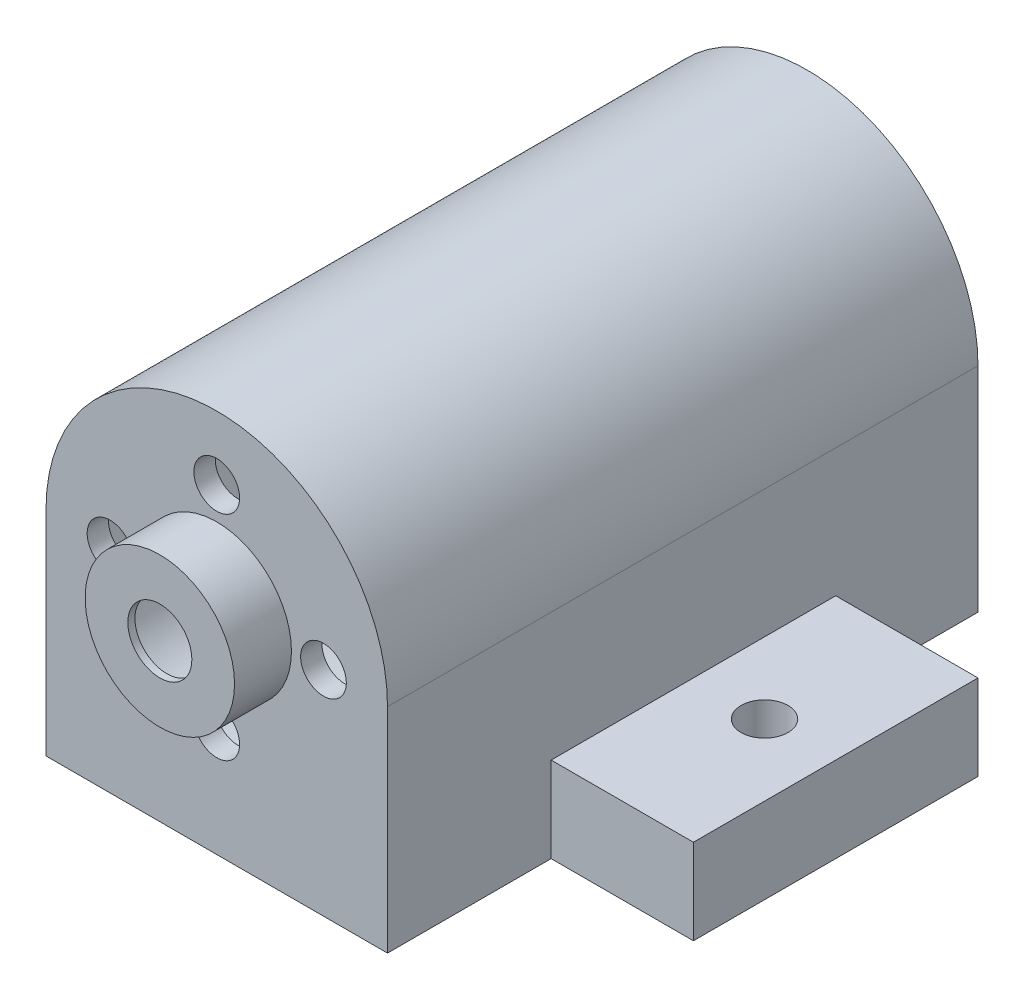
ISO-10303-21;
HEADER;
FILE_DESCRIPTION(('STEP AP214'),'2;1');
FILE_NAME('part.step','',(''),(''),'','','');
FILE_SCHEMA(('AUTOMOTIVE_DESIGN { 1 0 10303 214 1 1 1 1 }'));
ENDSEC;
DATA;
#1=APPLICATION_CONTEXT('core data for automotive mechanical design processes');
#2=APPLICATION_PROTOCOL_DEFINITION('international standard','automotive_design',2000,#1);
#3=PRODUCT_CONTEXT('',#1,'mechanical');
#4=PRODUCT('Part','Part','',(#3));
#5=PRODUCT_RELATED_PRODUCT_CATEGORY('part','',(#4));
#6=PRODUCT_DEFINITION_FORMATION('','',#4);
#7=PRODUCT_DEFINITION_CONTEXT('part definition',#1,'design');
#8=PRODUCT_DEFINITION('design','',#6,#7);
#9=PRODUCT_DEFINITION_SHAPE('','',#8);
#10=(LENGTH_UNIT() NAMED_UNIT(*) SI_UNIT(.MILLI.,.METRE.));
#11=(NAMED_UNIT(*) PLANE_ANGLE_UNIT() SI_UNIT($,.RADIAN.));
#12=(NAMED_UNIT(*) SI_UNIT($,.STERADIAN.) SOLID_ANGLE_UNIT());
#13=UNCERTAINTY_MEASURE_WITH_UNIT(LENGTH_MEASURE(1.E-05),#10,'distance_accuracy_value','');
#14=(GEOMETRIC_REPRESENTATION_CONTEXT(3) GLOBAL_UNCERTAINTY_ASSIGNED_CONTEXT((#13)) GLOBAL_UNIT_ASSIGNED_CONTEXT((#10,
#11,#12)) REPRESENTATION_CONTEXT('',''));
#15=CARTESIAN_POINT('',(0.,0.,0.));
#16=DIRECTION('',(0.,0.,1.));
#17=DIRECTION('',(1.,0.,0.));
#18=AXIS2_PLACEMENT_3D('',#15,#16,#17);
#19=CARTESIAN_POINT('',(-728.422782565498,1.40916900988348,1.5));
#20=DIRECTION('',(0.,0.,-1.));
#21=DIRECTION('',(-1.,0.,0.));
#22=AXIS2_PLACEMENT_3D('',#19,#20,#21);
#23=CYLINDRICAL_SURFACE('',#22,12.);
#24=DIRECTION('',(0.,0.,-1.));
#25=VECTOR('',#24,1.);
#26=CARTESIAN_POINT('',(-740.422782565498,1.40916900988348,1.5));
#27=LINE('',#26,#25);
#28=CARTESIAN_POINT('',(-740.422782565498,1.40916900988348,1.5));
#29=VERTEX_POINT('',#28);
#30=CARTESIAN_POINT('',(-740.422782565498,1.40916900988348,-40.));
#31=VERTEX_POINT('',#30);
#32=EDGE_CURVE('E248',#29,#31,#27,.T.);
#33=ORIENTED_EDGE('',*,*,#32,.F.);
#34=CARTESIAN_POINT('',(-728.422782565498,1.40916900988348,1.5));
#35=DIRECTION('',(0.,0.,1.));
#36=DIRECTION('',(1.,0.,0.));
#37=AXIS2_PLACEMENT_3D('',#34,#35,#36);
#38=CIRCLE('',#37,12.);
#39=CARTESIAN_POINT('',(-716.422782565498,1.40916900988348,1.5));
#40=VERTEX_POINT('',#39);
#41=EDGE_CURVE('E11',#40,#29,#38,.T.);
#42=ORIENTED_EDGE('',*,*,#41,.F.);
#43=DIRECTION('',(0.,0.,-1.));
#44=VECTOR('',#43,1.);
#45=CARTESIAN_POINT('',(-716.422782565498,1.40916900988348,1.5));
#46=LINE('',#45,#44);
#47=CARTESIAN_POINT('',(-716.422782565498,1.40916900988348,-40.));
#48=VERTEX_POINT('',#47);
#49=EDGE_CURVE('E238',#40,#48,#46,.T.);
#50=ORIENTED_EDGE('',*,*,#49,.T.);
#51=CARTESIAN_POINT('',(-728.422782565498,1.40916900988348,-40.));
#52=DIRECTION('',(0.,0.,-1.));
#53=DIRECTION('',(-1.,0.,0.));
#54=AXIS2_PLACEMENT_3D('',#51,#52,#53);
#55=CIRCLE('',#54,12.);
#56=EDGE_CURVE('E268',#31,#48,#55,.T.);
#57=ORIENTED_EDGE('',*,*,#56,.F.);
#58=EDGE_LOOP('',(#33,#42,#50,#57));
#59=FACE_BOUND('',#58,.T.);
#60=ADVANCED_FACE('F44',(#59),#23,.T.);
#61=CARTESIAN_POINT('',(-728.422782565498,1.40916900988348,0.));
#62=DIRECTION('',(0.,0.,1.));
#63=DIRECTION('',(1.,0.,0.));
#64=AXIS2_PLACEMENT_3D('',#61,#62,#63);
#65=PLANE('',#64);
#66=CARTESIAN_POINT('',(-735.922782565498,1.40916900988364,0.));
#67=DIRECTION('',(0.,0.,1.));
#68=DIRECTION('',(1.,0.,0.));
#69=AXIS2_PLACEMENT_3D('',#66,#67,#68);
#70=CIRCLE('',#69,1.60659030912174);
#71=CARTESIAN_POINT('',(-734.316192256376,1.40916900988364,0.));
#72=VERTEX_POINT('',#71);
#73=EDGE_CURVE('E300',#72,#72,#70,.T.);
#74=ORIENTED_EDGE('',*,*,#73,.T.);
#75=EDGE_LOOP('',(#74));
#76=FACE_BOUND('',#75,.T.);
#77=CARTESIAN_POINT('',(-728.422782565498,-6.09083099011652,0.));
#78=DIRECTION('',(0.,0.,1.));
#79=DIRECTION('',(1.,0.,0.));
#80=AXIS2_PLACEMENT_3D('',#77,#78,#79);
#81=CIRCLE('',#80,1.60659030912175);
#82=CARTESIAN_POINT('',(-726.816192256376,-6.09083099011652,0.));
#83=VERTEX_POINT('',#82);
#84=EDGE_CURVE('E315',#83,#83,#81,.T.);
#85=ORIENTED_EDGE('',*,*,#84,.T.);
#86=EDGE_LOOP('',(#85));
#87=FACE_BOUND('',#86,.T.);
#88=CARTESIAN_POINT('',(-720.922782565498,1.40916900988353,0.));
#89=DIRECTION('',(0.,0.,1.));
#90=DIRECTION('',(1.,0.,0.));
#91=AXIS2_PLACEMENT_3D('',#88,#89,#90);
#92=CIRCLE('',#91,1.60659030912174);
#93=CARTESIAN_POINT('',(-719.316192256376,1.40916900988353,0.));
#94=VERTEX_POINT('',#93);
#95=EDGE_CURVE('E319',#94,#94,#92,.T.);
#96=ORIENTED_EDGE('',*,*,#95,.T.);
#97=EDGE_LOOP('',(#96));
#98=FACE_BOUND('',#97,.T.);
#99=CARTESIAN_POINT('',(-728.422782565498,8.90916900988348,0.));
#100=DIRECTION('',(0.,0.,1.));
#101=DIRECTION('',(1.,0.,0.));
#102=AXIS2_PLACEMENT_3D('',#99,#100,#101);
#103=CIRCLE('',#102,1.60659030912175);
#104=CARTESIAN_POINT('',(-726.816192256376,8.90916900988348,0.));
#105=VERTEX_POINT('',#104);
#106=EDGE_CURVE('E53',#105,#105,#103,.T.);
#107=ORIENTED_EDGE('',*,*,#106,.T.);
#108=EDGE_LOOP('',(#107));
#109=FACE_BOUND('',#108,.T.);
#110=CARTESIAN_POINT('',(-728.422782565498,1.40916900988348,0.));
#111=DIRECTION('',(0.,0.,-1.));
#112=DIRECTION('',(-1.,0.,0.));
#113=AXIS2_PLACEMENT_3D('',#110,#111,#112);
#114=CIRCLE('',#113,5.09999999999998);
#115=CARTESIAN_POINT('',(-733.522782565498,1.40916900988348,0.));
#116=VERTEX_POINT('',#115);
#117=EDGE_CURVE('E284',#116,#116,#114,.T.);
#118=ORIENTED_EDGE('',*,*,#117,.F.);
#119=EDGE_LOOP('',(#118));
#120=FACE_BOUND('',#119,.T.);
#121=CARTESIAN_POINT('',(-728.422782565498,1.40916900988348,0.));
#122=DIRECTION('',(0.,0.,-1.));
#123=DIRECTION('',(-1.,0.,0.));
#124=AXIS2_PLACEMENT_3D('',#121,#122,#123);
#125=CIRCLE('',#124,11.2499999999999);
#126=CARTESIAN_POINT('',(-739.672782565498,1.40916900988348,0.));
#127=VERTEX_POINT('',#126);
#128=EDGE_CURVE('E252',#127,#127,#125,.T.);
#129=ORIENTED_EDGE('',*,*,#128,.T.);
#130=EDGE_LOOP('',(#129));
#131=FACE_BOUND('',#130,.T.);
#132=ADVANCED_FACE('F326',(#76,#87,#98,#109,#120,#131),#65,.F.);
#133=CARTESIAN_POINT('',(-728.422782565498,1.40916900988348,1.5));
#134=DIRECTION('',(0.,0.,1.));
#135=DIRECTION('',(1.,0.,0.));
#136=AXIS2_PLACEMENT_3D('',#133,#134,#135);
#137=PLANE('',#136);
#138=CARTESIAN_POINT('',(-728.422782565498,1.40916900988348,1.5));
#139=DIRECTION('',(0.,0.,1.));
#140=DIRECTION('',(1.,0.,0.));
#141=AXIS2_PLACEMENT_3D('',#138,#139,#140);
#142=CIRCLE('',#141,5.24999999999995);
#143=CARTESIAN_POINT('',(-723.172782565498,1.40916900988348,1.5));
#144=VERTEX_POINT('',#143);
#145=EDGE_CURVE('E283',#144,#144,#142,.T.);
#146=ORIENTED_EDGE('',*,*,#145,.F.);
#147=EDGE_LOOP('',(#146));
#148=FACE_BOUND('',#147,.T.);
#149=CARTESIAN_POINT('',(-728.422782565498,8.90916900988348,1.5));
#150=DIRECTION('',(0.,0.,1.));
#151=DIRECTION('',(1.,0.,0.));
#152=AXIS2_PLACEMENT_3D('',#149,#150,#151);
#153=CIRCLE('',#152,1.60659030912175);
#154=CARTESIAN_POINT('',(-726.816192256376,8.90916900988348,1.5));
#155=VERTEX_POINT('',#154);
#156=EDGE_CURVE('E296',#155,#155,#153,.T.);
#157=ORIENTED_EDGE('',*,*,#156,.F.);
#158=EDGE_LOOP('',(#157));
#159=FACE_BOUND('',#158,.T.);
#160=CARTESIAN_POINT('',(-720.922782565498,1.40916900988353,1.5));
#161=DIRECTION('',(0.,0.,1.));
#162=DIRECTION('',(1.,0.,0.));
#163=AXIS2_PLACEMENT_3D('',#160,#161,#162);
#164=CIRCLE('',#163,1.60659030912174);
#165=CARTESIAN_POINT('',(-719.316192256376,1.40916900988353,1.5));
#166=VERTEX_POINT('',#165);
#167=EDGE_CURVE('E301',#166,#166,#164,.T.);
#168=ORIENTED_EDGE('',*,*,#167,.F.);
#169=EDGE_LOOP('',(#168));
#170=FACE_BOUND('',#169,.T.);
#171=CARTESIAN_POINT('',(-728.422782565498,-6.09083099011652,1.5));
#172=DIRECTION('',(0.,0.,1.));
#173=DIRECTION('',(1.,0.,0.));
#174=AXIS2_PLACEMENT_3D('',#171,#172,#173);
#175=CIRCLE('',#174,1.60659030912175);
#176=CARTESIAN_POINT('',(-726.816192256376,-6.09083099011652,1.5));
#177=VERTEX_POINT('',#176);
#178=EDGE_CURVE('E305',#177,#177,#175,.T.);
#179=ORIENTED_EDGE('',*,*,#178,.F.);
#180=EDGE_LOOP('',(#179));
#181=FACE_BOUND('',#180,.T.);
#182=CARTESIAN_POINT('',(-735.922782565498,1.40916900988364,1.5));
#183=DIRECTION('',(0.,0.,1.));
#184=DIRECTION('',(1.,0.,0.));
#185=AXIS2_PLACEMENT_3D('',#182,#183,#184);
#186=CIRCLE('',#185,1.60659030912174);
#187=CARTESIAN_POINT('',(-734.316192256376,1.40916900988364,1.5));
#188=VERTEX_POINT('',#187);
#189=EDGE_CURVE('E292',#188,#188,#186,.T.);
#190=ORIENTED_EDGE('',*,*,#189,.F.);
#191=EDGE_LOOP('',(#190));
#192=FACE_BOUND('',#191,.T.);
#193=ORIENTED_EDGE('',*,*,#41,.T.);
#194=DIRECTION('',(0.,1.,0.));
#195=VECTOR('',#194,1.);
#196=CARTESIAN_POINT('',(-740.422782565498,1.40916900988348,1.5));
#197=LINE('',#196,#195);
#198=CARTESIAN_POINT('',(-740.422782565498,-13.5908309901165,1.5));
#199=VERTEX_POINT('',#198);
#200=EDGE_CURVE('E235',#199,#29,#197,.T.);
#201=ORIENTED_EDGE('',*,*,#200,.F.);
#202=DIRECTION('',(-1.,0.,0.));
#203=VECTOR('',#202,1.);
#204=CARTESIAN_POINT('',(-716.422782565498,-13.5908309901165,1.5));
#205=LINE('',#204,#203);
#206=CARTESIAN_POINT('',(-716.422782565498,-13.5908309901165,1.5));
#207=VERTEX_POINT('',#206);
#208=EDGE_CURVE('E231',#207,#199,#205,.T.);
#209=ORIENTED_EDGE('',*,*,#208,.F.);
#210=DIRECTION('',(0.,-1.,0.));
#211=VECTOR('',#210,1.);
#212=CARTESIAN_POINT('',(-716.422782565498,1.40916900988348,1.5));
#213=LINE('',#212,#211);
#214=EDGE_CURVE('E227',#40,#207,#213,.T.);
#215=ORIENTED_EDGE('',*,*,#214,.F.);
#216=EDGE_LOOP('',(#193,#201,#209,#215));
#217=FACE_BOUND('',#216,.T.);
#218=ADVANCED_FACE('F352',(#148,#159,#170,#181,#192,#217),#137,.T.);
#219=CARTESIAN_POINT('',(-735.922782565498,1.40916900988364,-0.499999999999999));
#220=DIRECTION('',(0.,0.,1.));
#221=DIRECTION('',(1.,0.,0.));
#222=AXIS2_PLACEMENT_3D('',#219,#220,#221);
#223=CYLINDRICAL_SURFACE('',#222,1.60659030912174);
#224=ORIENTED_EDGE('',*,*,#189,.T.);
#225=EDGE_LOOP('',(#224));
#226=FACE_BOUND('',#225,.T.);
#227=ORIENTED_EDGE('',*,*,#73,.F.);
#228=EDGE_LOOP('',(#227));
#229=FACE_BOUND('',#228,.T.);
#230=ADVANCED_FACE('F417',(#226,#229),#223,.F.);
#231=CARTESIAN_POINT('',(-728.422782565498,-6.09083099011652,-0.499999999999999));
#232=DIRECTION('',(0.,0.,1.));
#233=DIRECTION('',(1.,0.,0.));
#234=AXIS2_PLACEMENT_3D('',#231,#232,#233);
#235=CYLINDRICAL_SURFACE('',#234,1.60659030912175);
#236=ORIENTED_EDGE('',*,*,#178,.T.);
#237=EDGE_LOOP('',(#236));
#238=FACE_BOUND('',#237,.T.);
#239=ORIENTED_EDGE('',*,*,#84,.F.);
#240=EDGE_LOOP('',(#239));
#241=FACE_BOUND('',#240,.T.);
#242=ADVANCED_FACE('F342',(#238,#241),#235,.F.);
#243=CARTESIAN_POINT('',(-720.922782565498,1.40916900988353,-0.499999999999999));
#244=DIRECTION('',(0.,0.,1.));
#245=DIRECTION('',(1.,0.,0.));
#246=AXIS2_PLACEMENT_3D('',#243,#244,#245);
#247=CYLINDRICAL_SURFACE('',#246,1.60659030912174);
#248=ORIENTED_EDGE('',*,*,#167,.T.);
#249=EDGE_LOOP('',(#248));
#250=FACE_BOUND('',#249,.T.);
#251=ORIENTED_EDGE('',*,*,#95,.F.);
#252=EDGE_LOOP('',(#251));
#253=FACE_BOUND('',#252,.T.);
#254=ADVANCED_FACE('F332',(#250,#253),#247,.F.);
#255=CARTESIAN_POINT('',(-728.422782565498,8.90916900988348,-0.499999999999999));
#256=DIRECTION('',(0.,0.,1.));
#257=DIRECTION('',(1.,0.,0.));
#258=AXIS2_PLACEMENT_3D('',#255,#256,#257);
#259=CYLINDRICAL_SURFACE('',#258,1.60659030912175);
#260=ORIENTED_EDGE('',*,*,#156,.T.);
#261=EDGE_LOOP('',(#260));
#262=FACE_BOUND('',#261,.T.);
#263=ORIENTED_EDGE('',*,*,#106,.F.);
#264=EDGE_LOOP('',(#263));
#265=FACE_BOUND('',#264,.T.);
#266=ADVANCED_FACE('F329',(#262,#265),#259,.F.);
#267=CARTESIAN_POINT('',(-728.422782565498,1.40916900988348,5.5));
#268=DIRECTION('',(0.,0.,-1.));
#269=DIRECTION('',(-1.,0.,0.));
#270=AXIS2_PLACEMENT_3D('',#267,#268,#269);
#271=CYLINDRICAL_SURFACE('',#270,5.24999999999995);
#272=CARTESIAN_POINT('',(-728.422782565498,1.40916900988348,5.5));
#273=DIRECTION('',(0.,0.,1.));
#274=DIRECTION('',(1.,0.,0.));
#275=AXIS2_PLACEMENT_3D('',#272,#273,#274);
#276=CIRCLE('',#275,5.24999999999995);
#277=CARTESIAN_POINT('',(-723.172782565498,1.40916900988348,5.5));
#278=VERTEX_POINT('',#277);
#279=EDGE_CURVE('E288',#278,#278,#276,.T.);
#280=ORIENTED_EDGE('',*,*,#279,.F.);
#281=EDGE_LOOP('',(#280));
#282=FACE_BOUND('',#281,.T.);
#283=ORIENTED_EDGE('',*,*,#145,.T.);
#284=EDGE_LOOP('',(#283));
#285=FACE_BOUND('',#284,.T.);
#286=ADVANCED_FACE('F331',(#282,#285),#271,.T.);
#287=CARTESIAN_POINT('',(-728.422782565498,1.40916900988348,5.5));
#288=DIRECTION('',(0.,0.,1.));
#289=DIRECTION('',(1.,0.,0.));
#290=AXIS2_PLACEMENT_3D('',#287,#288,#289);
#291=PLANE('',#290);
#292=CARTESIAN_POINT('',(-728.422782565498,1.40916900988348,5.5));
#293=DIRECTION('',(0.,0.,1.));
#294=DIRECTION('',(1.,0.,0.));
#295=AXIS2_PLACEMENT_3D('',#292,#293,#294);
#296=CIRCLE('',#295,2.25000000000001);
#297=CARTESIAN_POINT('',(-726.172782565498,1.40916900988348,5.5));
#298=VERTEX_POINT('',#297);
#299=EDGE_CURVE('E275',#298,#298,#296,.T.);
#300=ORIENTED_EDGE('',*,*,#299,.F.);
#301=EDGE_LOOP('',(#300));
#302=FACE_BOUND('',#301,.T.);
#303=ORIENTED_EDGE('',*,*,#279,.T.);
#304=EDGE_LOOP('',(#303));
#305=FACE_BOUND('',#304,.T.);
#306=ADVANCED_FACE('F339',(#302,#305),#291,.T.);
#307=CARTESIAN_POINT('',(-728.422782565498,1.40916900988348,5.));
#308=DIRECTION('',(0.,0.,-1.));
#309=DIRECTION('',(-1.,0.,0.));
#310=AXIS2_PLACEMENT_3D('',#307,#308,#309);
#311=CYLINDRICAL_SURFACE('',#310,5.09999999999998);
#312=CARTESIAN_POINT('',(-728.422782565498,1.40916900988348,5.));
#313=DIRECTION('',(0.,0.,-1.));
#314=DIRECTION('',(-1.,0.,0.));
#315=AXIS2_PLACEMENT_3D('',#312,#313,#314);
#316=CIRCLE('',#315,5.09999999999998);
#317=CARTESIAN_POINT('',(-733.522782565498,1.40916900988348,5.));
#318=VERTEX_POINT('',#317);
#319=EDGE_CURVE('E279',#318,#318,#316,.T.);
#320=ORIENTED_EDGE('',*,*,#319,.F.);
#321=EDGE_LOOP('',(#320));
#322=FACE_BOUND('',#321,.T.);
#323=ORIENTED_EDGE('',*,*,#117,.T.);
#324=EDGE_LOOP('',(#323));
#325=FACE_BOUND('',#324,.T.);
#326=ADVANCED_FACE('F381',(#322,#325),#311,.F.);
#327=CARTESIAN_POINT('',(-728.422782565498,1.40916900988348,5.));
#328=DIRECTION('',(0.,0.,-1.));
#329=DIRECTION('',(-1.,0.,0.));
#330=AXIS2_PLACEMENT_3D('',#327,#328,#329);
#331=PLANE('',#330);
#332=CARTESIAN_POINT('',(-728.422782565498,1.40916900988348,5.));
#333=DIRECTION('',(0.,0.,-1.));
#334=DIRECTION('',(-1.,0.,0.));
#335=AXIS2_PLACEMENT_3D('',#332,#333,#334);
#336=CIRCLE('',#335,2.25000000000001);
#337=CARTESIAN_POINT('',(-730.672782565498,1.40916900988348,5.));
#338=VERTEX_POINT('',#337);
#339=EDGE_CURVE('E47',#338,#338,#336,.T.);
#340=ORIENTED_EDGE('',*,*,#339,.F.);
#341=EDGE_LOOP('',(#340));
#342=FACE_BOUND('',#341,.T.);
#343=ORIENTED_EDGE('',*,*,#319,.T.);
#344=EDGE_LOOP('',(#343));
#345=FACE_BOUND('',#344,.T.);
#346=ADVANCED_FACE('F378',(#342,#345),#331,.T.);
#347=CARTESIAN_POINT('',(-728.422782565498,1.40916900988348,0.5));
#348=DIRECTION('',(0.,0.,1.));
#349=DIRECTION('',(1.,0.,0.));
#350=AXIS2_PLACEMENT_3D('',#347,#348,#349);
#351=CYLINDRICAL_SURFACE('',#350,2.25000000000001);
#352=ORIENTED_EDGE('',*,*,#339,.T.);
#353=EDGE_LOOP('',(#352));
#354=FACE_BOUND('',#353,.T.);
#355=ORIENTED_EDGE('',*,*,#299,.T.);
#356=EDGE_LOOP('',(#355));
#357=FACE_BOUND('',#356,.T.);
#358=ADVANCED_FACE('F375',(#354,#357),#351,.F.);
#359=CARTESIAN_POINT('',(-728.422782565498,1.40916900988348,-40.));
#360=DIRECTION('',(0.,0.,-1.));
#361=DIRECTION('',(-1.,0.,0.));
#362=AXIS2_PLACEMENT_3D('',#359,#360,#361);
#363=PLANE('',#362);
#364=ORIENTED_EDGE('',*,*,#56,.T.);
#365=DIRECTION('',(0.,-1.,0.));
#366=VECTOR('',#365,1.);
#367=CARTESIAN_POINT('',(-716.422782565498,1.40916900988348,-40.));
#368=LINE('',#367,#366);
#369=CARTESIAN_POINT('',(-716.422782565498,-13.5908309901165,-40.));
#370=VERTEX_POINT('',#369);
#371=EDGE_CURVE('E226',#48,#370,#368,.T.);
#372=ORIENTED_EDGE('',*,*,#371,.T.);
#373=DIRECTION('',(-1.,0.,0.));
#374=VECTOR('',#373,1.);
#375=CARTESIAN_POINT('',(-740.422782565498,-13.5908309901165,-40.));
#376=LINE('',#375,#374);
#377=CARTESIAN_POINT('',(-740.422782565498,-13.5908309901165,-40.));
#378=VERTEX_POINT('',#377);
#379=EDGE_CURVE('E242',#370,#378,#376,.T.);
#380=ORIENTED_EDGE('',*,*,#379,.T.);
#381=DIRECTION('',(0.,1.,0.));
#382=VECTOR('',#381,1.);
#383=CARTESIAN_POINT('',(-740.422782565498,1.40916900988348,-40.));
#384=LINE('',#383,#382);
#385=EDGE_CURVE('E232',#378,#31,#384,.T.);
#386=ORIENTED_EDGE('',*,*,#385,.T.);
#387=EDGE_LOOP('',(#364,#372,#380,#386));
#388=FACE_BOUND('',#387,.T.);
#389=CARTESIAN_POINT('',(-728.422782565498,1.40916900988348,-40.));
#390=DIRECTION('',(0.,0.,-1.));
#391=DIRECTION('',(-1.,0.,0.));
#392=AXIS2_PLACEMENT_3D('',#389,#390,#391);
#393=CIRCLE('',#392,11.2499999999999);
#394=CARTESIAN_POINT('',(-739.672782565498,1.40916900988348,-40.));
#395=VERTEX_POINT('',#394);
#396=EDGE_CURVE('E264',#395,#395,#393,.T.);
#397=ORIENTED_EDGE('',*,*,#396,.F.);
#398=EDGE_LOOP('',(#397));
#399=FACE_BOUND('',#398,.T.);
#400=ADVANCED_FACE('F365',(#388,#399),#363,.T.);
#401=CARTESIAN_POINT('',(-728.422782565498,1.40916900988348,-40.));
#402=DIRECTION('',(0.,0.,1.));
#403=DIRECTION('',(1.,0.,0.));
#404=AXIS2_PLACEMENT_3D('',#401,#402,#403);
#405=CYLINDRICAL_SURFACE('',#404,11.2499999999999);
#406=ORIENTED_EDGE('',*,*,#396,.T.);
#407=EDGE_LOOP('',(#406));
#408=FACE_BOUND('',#407,.T.);
#409=ORIENTED_EDGE('',*,*,#128,.F.);
#410=EDGE_LOOP('',(#409));
#411=FACE_BOUND('',#410,.T.);
#412=ADVANCED_FACE('F392',(#408,#411),#405,.F.);
#413=CARTESIAN_POINT('',(-740.422782565498,1.40916900988348,1.5));
#414=DIRECTION('',(-1.,0.,0.));
#415=DIRECTION('',(0.,0.,1.));
#416=AXIS2_PLACEMENT_3D('',#413,#414,#415);
#417=PLANE('',#416);
#418=DIRECTION('',(0.,-1.,0.));
#419=VECTOR('',#418,1.);
#420=CARTESIAN_POINT('',(-740.422782565498,-7.59083099011652,-10.));
#421=LINE('',#420,#419);
#422=CARTESIAN_POINT('',(-740.422782565498,-7.59083099011652,-10.));
#423=VERTEX_POINT('',#422);
#424=CARTESIAN_POINT('',(-740.422782565498,-13.5908309901165,-10.));
#425=VERTEX_POINT('',#424);
#426=EDGE_CURVE('E181',#423,#425,#421,.T.);
#427=ORIENTED_EDGE('',*,*,#426,.T.);
#428=DIRECTION('',(0.,0.,-1.));
#429=VECTOR('',#428,1.);
#430=CARTESIAN_POINT('',(-740.422782565498,-13.5908309901165,1.5));
#431=LINE('',#430,#429);
#432=EDGE_CURVE('E253',#199,#425,#431,.T.);
#433=ORIENTED_EDGE('',*,*,#432,.F.);
#434=ORIENTED_EDGE('',*,*,#200,.T.);
#435=ORIENTED_EDGE('',*,*,#32,.T.);
#436=ORIENTED_EDGE('',*,*,#385,.F.);
#437=CARTESIAN_POINT('',(-740.422782565498,-13.5908309901165,-30.));
#438=VERTEX_POINT('',#437);
#439=EDGE_CURVE('E257',#438,#378,#431,.T.);
#440=ORIENTED_EDGE('',*,*,#439,.F.);
#441=DIRECTION('',(0.,1.,0.));
#442=VECTOR('',#441,1.);
#443=CARTESIAN_POINT('',(-740.422782565498,-13.5908309901165,-30.));
#444=LINE('',#443,#442);
#445=CARTESIAN_POINT('',(-740.422782565498,-7.59083099011652,-30.));
#446=VERTEX_POINT('',#445);
#447=EDGE_CURVE('E191',#438,#446,#444,.T.);
#448=ORIENTED_EDGE('',*,*,#447,.T.);
#449=DIRECTION('',(0.,0.,1.));
#450=VECTOR('',#449,1.);
#451=CARTESIAN_POINT('',(-740.422782565498,-7.59083099011652,-30.));
#452=LINE('',#451,#450);
#453=EDGE_CURVE('E207',#446,#423,#452,.T.);
#454=ORIENTED_EDGE('',*,*,#453,.T.);
#455=EDGE_LOOP('',(#427,#433,#434,#435,#436,#440,#448,#454));
#456=FACE_BOUND('',#455,.T.);
#457=ADVANCED_FACE('F368',(#456),#417,.T.);
#458=CARTESIAN_POINT('',(-740.422782565498,-13.5908309901165,1.5));
#459=DIRECTION('',(0.,-1.,0.));
#460=DIRECTION('',(0.,0.,-1.));
#461=AXIS2_PLACEMENT_3D('',#458,#459,#460);
#462=PLANE('',#461);
#463=CARTESIAN_POINT('',(-745.422782565498,-13.5908309901165,-20.));
#464=DIRECTION('',(0.,-1.,0.));
#465=DIRECTION('',(0.,0.,-1.));
#466=AXIS2_PLACEMENT_3D('',#463,#464,#465);
#467=CIRCLE('',#466,1.65000000000005);
#468=CARTESIAN_POINT('',(-745.422782565498,-13.5908309901165,-21.65));
#469=VERTEX_POINT('',#468);
#470=EDGE_CURVE('E167',#469,#469,#467,.T.);
#471=ORIENTED_EDGE('',*,*,#470,.F.);
#472=EDGE_LOOP('',(#471));
#473=FACE_BOUND('',#472,.T.);
#474=CARTESIAN_POINT('',(-711.422782565498,-13.5908309901165,-20.));
#475=DIRECTION('',(0.,-1.,0.));
#476=DIRECTION('',(0.,0.,-1.));
#477=AXIS2_PLACEMENT_3D('',#474,#475,#476);
#478=CIRCLE('',#477,1.65000000000005);
#479=CARTESIAN_POINT('',(-711.422782565498,-13.5908309901165,-21.65));
#480=VERTEX_POINT('',#479);
#481=EDGE_CURVE('E651',#480,#480,#478,.T.);
#482=ORIENTED_EDGE('',*,*,#481,.F.);
#483=EDGE_LOOP('',(#482));
#484=FACE_BOUND('',#483,.T.);
#485=ORIENTED_EDGE('',*,*,#379,.F.);
#486=DIRECTION('',(0.,0.,-1.));
#487=VECTOR('',#486,1.);
#488=CARTESIAN_POINT('',(-716.422782565498,-13.5908309901165,1.5));
#489=LINE('',#488,#487);
#490=CARTESIAN_POINT('',(-716.422782565498,-13.5908309901165,-30.));
#491=VERTEX_POINT('',#490);
#492=EDGE_CURVE('E141',#491,#370,#489,.T.);
#493=ORIENTED_EDGE('',*,*,#492,.F.);
#494=DIRECTION('',(-1.,0.,0.));
#495=VECTOR('',#494,1.);
#496=CARTESIAN_POINT('',(-706.422782565498,-13.5908309901165,-30.));
#497=LINE('',#496,#495);
#498=CARTESIAN_POINT('',(-706.422782565498,-13.5908309901165,-30.));
#499=VERTEX_POINT('',#498);
#500=EDGE_CURVE('E135',#499,#491,#497,.T.);
#501=ORIENTED_EDGE('',*,*,#500,.F.);
#502=DIRECTION('',(0.,0.,1.));
#503=VECTOR('',#502,1.);
#504=CARTESIAN_POINT('',(-706.422782565498,-13.5908309901165,-30.));
#505=LINE('',#504,#503);
#506=CARTESIAN_POINT('',(-706.422782565498,-13.5908309901165,-10.));
#507=VERTEX_POINT('',#506);
#508=EDGE_CURVE('E140',#499,#507,#505,.T.);
#509=ORIENTED_EDGE('',*,*,#508,.T.);
#510=DIRECTION('',(-1.,0.,0.));
#511=VECTOR('',#510,1.);
#512=CARTESIAN_POINT('',(-706.422782565498,-13.5908309901165,-10.));
#513=LINE('',#512,#511);
#514=CARTESIAN_POINT('',(-716.422782565498,-13.5908309901165,-10.));
#515=VERTEX_POINT('',#514);
#516=EDGE_CURVE('E146',#507,#515,#513,.T.);
#517=ORIENTED_EDGE('',*,*,#516,.T.);
#518=EDGE_CURVE('E258',#207,#515,#489,.T.);
#519=ORIENTED_EDGE('',*,*,#518,.F.);
#520=ORIENTED_EDGE('',*,*,#208,.T.);
#521=ORIENTED_EDGE('',*,*,#432,.T.);
#522=DIRECTION('',(1.,0.,0.));
#523=VECTOR('',#522,1.);
#524=CARTESIAN_POINT('',(-750.422782565498,-13.5908309901165,-10.));
#525=LINE('',#524,#523);
#526=CARTESIAN_POINT('',(-750.422782565498,-13.5908309901165,-10.));
#527=VERTEX_POINT('',#526);
#528=EDGE_CURVE('E223',#527,#425,#525,.T.);
#529=ORIENTED_EDGE('',*,*,#528,.F.);
#530=DIRECTION('',(0.,0.,1.));
#531=VECTOR('',#530,1.);
#532=CARTESIAN_POINT('',(-750.422782565498,-13.5908309901165,-30.));
#533=LINE('',#532,#531);
#534=CARTESIAN_POINT('',(-750.422782565498,-13.5908309901165,-30.));
#535=VERTEX_POINT('',#534);
#536=EDGE_CURVE('E187',#535,#527,#533,.T.);
#537=ORIENTED_EDGE('',*,*,#536,.F.);
#538=DIRECTION('',(1.,0.,0.));
#539=VECTOR('',#538,1.);
#540=CARTESIAN_POINT('',(-750.422782565498,-13.5908309901165,-30.));
#541=LINE('',#540,#539);
#542=EDGE_CURVE('E203',#535,#438,#541,.T.);
#543=ORIENTED_EDGE('',*,*,#542,.T.);
#544=ORIENTED_EDGE('',*,*,#439,.T.);
#545=EDGE_LOOP('',(#485,#493,#501,#509,#517,#519,#520,#521,#529,#537,#543,#544));
#546=FACE_BOUND('',#545,.T.);
#547=ADVANCED_FACE('F138',(#473,#484,#546),#462,.T.);
#548=CARTESIAN_POINT('',(-716.422782565498,1.40916900988348,1.5));
#549=DIRECTION('',(1.,0.,0.));
#550=DIRECTION('',(0.,0.,-1.));
#551=AXIS2_PLACEMENT_3D('',#548,#549,#550);
#552=PLANE('',#551);
#553=DIRECTION('',(0.,-1.,0.));
#554=VECTOR('',#553,1.);
#555=CARTESIAN_POINT('',(-716.422782565498,-7.59083099011652,-30.));
#556=LINE('',#555,#554);
#557=CARTESIAN_POINT('',(-716.422782565498,-7.59083099011652,-30.));
#558=VERTEX_POINT('',#557);
#559=EDGE_CURVE('E174',#558,#491,#556,.T.);
#560=ORIENTED_EDGE('',*,*,#559,.T.);
#561=ORIENTED_EDGE('',*,*,#492,.T.);
#562=ORIENTED_EDGE('',*,*,#371,.F.);
#563=ORIENTED_EDGE('',*,*,#49,.F.);
#564=ORIENTED_EDGE('',*,*,#214,.T.);
#565=ORIENTED_EDGE('',*,*,#518,.T.);
#566=DIRECTION('',(0.,1.,0.));
#567=VECTOR('',#566,1.);
#568=CARTESIAN_POINT('',(-716.422782565498,-13.5908309901165,-10.));
#569=LINE('',#568,#567);
#570=CARTESIAN_POINT('',(-716.422782565498,-7.59083099011652,-10.));
#571=VERTEX_POINT('',#570);
#572=EDGE_CURVE('E66',#515,#571,#569,.T.);
#573=ORIENTED_EDGE('',*,*,#572,.T.);
#574=DIRECTION('',(0.,0.,-1.));
#575=VECTOR('',#574,1.);
#576=CARTESIAN_POINT('',(-716.422782565498,-7.59083099011652,-10.));
#577=LINE('',#576,#575);
#578=EDGE_CURVE('E61',#571,#558,#577,.T.);
#579=ORIENTED_EDGE('',*,*,#578,.T.);
#580=EDGE_LOOP('',(#560,#561,#562,#563,#564,#565,#573,#579));
#581=FACE_BOUND('',#580,.T.);
#582=ADVANCED_FACE('F363',(#581),#552,.T.);
#583=CARTESIAN_POINT('',(-750.422782565498,-7.59083099011652,-10.));
#584=DIRECTION('',(0.,0.,1.));
#585=DIRECTION('',(0.,-1.,0.));
#586=AXIS2_PLACEMENT_3D('',#583,#584,#585);
#587=PLANE('',#586);
#588=ORIENTED_EDGE('',*,*,#426,.F.);
#589=DIRECTION('',(1.,0.,0.));
#590=VECTOR('',#589,1.);
#591=CARTESIAN_POINT('',(-750.422782565498,-7.59083099011652,-10.));
#592=LINE('',#591,#590);
#593=CARTESIAN_POINT('',(-750.422782565498,-7.59083099011652,-10.));
#594=VERTEX_POINT('',#593);
#595=EDGE_CURVE('E220',#594,#423,#592,.T.);
#596=ORIENTED_EDGE('',*,*,#595,.F.);
#597=DIRECTION('',(0.,-1.,0.));
#598=VECTOR('',#597,1.);
#599=CARTESIAN_POINT('',(-750.422782565498,-7.59083099011652,-10.));
#600=LINE('',#599,#598);
#601=EDGE_CURVE('E190',#594,#527,#600,.T.);
#602=ORIENTED_EDGE('',*,*,#601,.T.);
#603=ORIENTED_EDGE('',*,*,#528,.T.);
#604=EDGE_LOOP('',(#588,#596,#602,#603));
#605=FACE_BOUND('',#604,.T.);
#606=ADVANCED_FACE('F525',(#605),#587,.T.);
#607=CARTESIAN_POINT('',(-750.422782565498,-7.59083099011652,-30.));
#608=DIRECTION('',(0.,1.,0.));
#609=DIRECTION('',(0.,0.,1.));
#610=AXIS2_PLACEMENT_3D('',#607,#608,#609);
#611=PLANE('',#610);
#612=CARTESIAN_POINT('',(-745.422782565498,-7.59083099011652,-20.));
#613=DIRECTION('',(0.,1.,0.));
#614=DIRECTION('',(0.,0.,1.));
#615=AXIS2_PLACEMENT_3D('',#612,#613,#614);
#616=CIRCLE('',#615,1.65000000000005);
#617=CARTESIAN_POINT('',(-745.422782565498,-7.59083099011652,-18.35));
#618=VERTEX_POINT('',#617);
#619=EDGE_CURVE('E649',#618,#618,#616,.T.);
#620=ORIENTED_EDGE('',*,*,#619,.F.);
#621=EDGE_LOOP('',(#620));
#622=FACE_BOUND('',#621,.T.);
#623=ORIENTED_EDGE('',*,*,#453,.F.);
#624=DIRECTION('',(1.,0.,0.));
#625=VECTOR('',#624,1.);
#626=CARTESIAN_POINT('',(-750.422782565498,-7.59083099011652,-30.));
#627=LINE('',#626,#625);
#628=CARTESIAN_POINT('',(-750.422782565498,-7.59083099011652,-30.));
#629=VERTEX_POINT('',#628);
#630=EDGE_CURVE('E217',#629,#446,#627,.T.);
#631=ORIENTED_EDGE('',*,*,#630,.F.);
#632=DIRECTION('',(0.,0.,1.));
#633=VECTOR('',#632,1.);
#634=CARTESIAN_POINT('',(-750.422782565498,-7.59083099011652,-30.));
#635=LINE('',#634,#633);
#636=EDGE_CURVE('E195',#629,#594,#635,.T.);
#637=ORIENTED_EDGE('',*,*,#636,.T.);
#638=ORIENTED_EDGE('',*,*,#595,.T.);
#639=EDGE_LOOP('',(#623,#631,#637,#638));
#640=FACE_BOUND('',#639,.T.);
#641=ADVANCED_FACE('F529',(#622,#640),#611,.T.);
#642=CARTESIAN_POINT('',(-750.422782565498,-13.5908309901165,-30.));
#643=DIRECTION('',(0.,0.,-1.));
#644=DIRECTION('',(-1.,0.,0.));
#645=AXIS2_PLACEMENT_3D('',#642,#643,#644);
#646=PLANE('',#645);
#647=ORIENTED_EDGE('',*,*,#447,.F.);
#648=ORIENTED_EDGE('',*,*,#542,.F.);
#649=DIRECTION('',(0.,1.,0.));
#650=VECTOR('',#649,1.);
#651=CARTESIAN_POINT('',(-750.422782565498,-13.5908309901165,-30.));
#652=LINE('',#651,#650);
#653=EDGE_CURVE('E199',#535,#629,#652,.T.);
#654=ORIENTED_EDGE('',*,*,#653,.T.);
#655=ORIENTED_EDGE('',*,*,#630,.T.);
#656=EDGE_LOOP('',(#647,#648,#654,#655));
#657=FACE_BOUND('',#656,.T.);
#658=ADVANCED_FACE('F537',(#657),#646,.T.);
#659=CARTESIAN_POINT('',(-750.422782565498,0.,0.));
#660=DIRECTION('',(1.,0.,0.));
#661=DIRECTION('',(0.,0.,-1.));
#662=AXIS2_PLACEMENT_3D('',#659,#660,#661);
#663=PLANE('',#662);
#664=ORIENTED_EDGE('',*,*,#536,.T.);
#665=ORIENTED_EDGE('',*,*,#601,.F.);
#666=ORIENTED_EDGE('',*,*,#636,.F.);
#667=ORIENTED_EDGE('',*,*,#653,.F.);
#668=EDGE_LOOP('',(#664,#665,#666,#667));
#669=FACE_BOUND('',#668,.T.);
#670=ADVANCED_FACE('F541',(#669),#663,.F.);
#671=CARTESIAN_POINT('',(-706.422782565498,-7.59083099011652,-30.));
#672=DIRECTION('',(0.,0.,-1.));
#673=DIRECTION('',(-1.,0.,0.));
#674=AXIS2_PLACEMENT_3D('',#671,#672,#673);
#675=PLANE('',#674);
#676=ORIENTED_EDGE('',*,*,#559,.F.);
#677=DIRECTION('',(-1.,0.,0.));
#678=VECTOR('',#677,1.);
#679=CARTESIAN_POINT('',(-706.422782565498,-7.59083099011652,-30.));
#680=LINE('',#679,#678);
#681=CARTESIAN_POINT('',(-706.422782565498,-7.59083099011652,-30.));
#682=VERTEX_POINT('',#681);
#683=EDGE_CURVE('E161',#682,#558,#680,.T.);
#684=ORIENTED_EDGE('',*,*,#683,.F.);
#685=DIRECTION('',(0.,-1.,0.));
#686=VECTOR('',#685,1.);
#687=CARTESIAN_POINT('',(-706.422782565498,-7.59083099011652,-30.));
#688=LINE('',#687,#686);
#689=EDGE_CURVE('E154',#682,#499,#688,.T.);
#690=ORIENTED_EDGE('',*,*,#689,.T.);
#691=ORIENTED_EDGE('',*,*,#500,.T.);
#692=EDGE_LOOP('',(#676,#684,#690,#691));
#693=FACE_BOUND('',#692,.T.);
#694=ADVANCED_FACE('F160',(#693),#675,.T.);
#695=CARTESIAN_POINT('',(-706.422782565498,-7.59083099011652,-10.));
#696=DIRECTION('',(0.,1.,0.));
#697=DIRECTION('',(0.,0.,1.));
#698=AXIS2_PLACEMENT_3D('',#695,#696,#697);
#699=PLANE('',#698);
#700=CARTESIAN_POINT('',(-711.422782565498,-7.59083099011652,-20.));
#701=DIRECTION('',(0.,1.,0.));
#702=DIRECTION('',(0.,0.,1.));
#703=AXIS2_PLACEMENT_3D('',#700,#701,#702);
#704=CIRCLE('',#703,1.65000000000005);
#705=CARTESIAN_POINT('',(-711.422782565498,-7.59083099011652,-18.3499999999999));
#706=VERTEX_POINT('',#705);
#707=EDGE_CURVE('E652',#706,#706,#704,.T.);
#708=ORIENTED_EDGE('',*,*,#707,.F.);
#709=EDGE_LOOP('',(#708));
#710=FACE_BOUND('',#709,.T.);
#711=ORIENTED_EDGE('',*,*,#578,.F.);
#712=DIRECTION('',(-1.,0.,0.));
#713=VECTOR('',#712,1.);
#714=CARTESIAN_POINT('',(-706.422782565498,-7.59083099011652,-10.));
#715=LINE('',#714,#713);
#716=CARTESIAN_POINT('',(-706.422782565498,-7.59083099011652,-10.));
#717=VERTEX_POINT('',#716);
#718=EDGE_CURVE('E182',#717,#571,#715,.T.);
#719=ORIENTED_EDGE('',*,*,#718,.F.);
#720=DIRECTION('',(0.,0.,-1.));
#721=VECTOR('',#720,1.);
#722=CARTESIAN_POINT('',(-706.422782565498,-7.59083099011652,-10.));
#723=LINE('',#722,#721);
#724=EDGE_CURVE('E147',#717,#682,#723,.T.);
#725=ORIENTED_EDGE('',*,*,#724,.T.);
#726=ORIENTED_EDGE('',*,*,#683,.T.);
#727=EDGE_LOOP('',(#711,#719,#725,#726));
#728=FACE_BOUND('',#727,.T.);
#729=ADVANCED_FACE('F566',(#710,#728),#699,.T.);
#730=CARTESIAN_POINT('',(-706.422782565498,-13.5908309901165,-10.));
#731=DIRECTION('',(0.,0.,1.));
#732=DIRECTION('',(1.,0.,0.));
#733=AXIS2_PLACEMENT_3D('',#730,#731,#732);
#734=PLANE('',#733);
#735=ORIENTED_EDGE('',*,*,#572,.F.);
#736=ORIENTED_EDGE('',*,*,#516,.F.);
#737=DIRECTION('',(0.,1.,0.));
#738=VECTOR('',#737,1.);
#739=CARTESIAN_POINT('',(-706.422782565498,-13.5908309901165,-10.));
#740=LINE('',#739,#738);
#741=EDGE_CURVE('E157',#507,#717,#740,.T.);
#742=ORIENTED_EDGE('',*,*,#741,.T.);
#743=ORIENTED_EDGE('',*,*,#718,.T.);
#744=EDGE_LOOP('',(#735,#736,#742,#743));
#745=FACE_BOUND('',#744,.T.);
#746=ADVANCED_FACE('F572',(#745),#734,.T.);
#747=CARTESIAN_POINT('',(-706.422782565498,0.,0.));
#748=DIRECTION('',(-1.,0.,0.));
#749=DIRECTION('',(0.,0.,1.));
#750=AXIS2_PLACEMENT_3D('',#747,#748,#749);
#751=PLANE('',#750);
#752=ORIENTED_EDGE('',*,*,#689,.F.);
#753=ORIENTED_EDGE('',*,*,#724,.F.);
#754=ORIENTED_EDGE('',*,*,#741,.F.);
#755=ORIENTED_EDGE('',*,*,#508,.F.);
#756=EDGE_LOOP('',(#752,#753,#754,#755));
#757=FACE_BOUND('',#756,.T.);
#758=ADVANCED_FACE('F152',(#757),#751,.F.);
#759=CARTESIAN_POINT('',(-711.422782565498,-17.5908309901165,-20.));
#760=DIRECTION('',(0.,1.,0.));
#761=DIRECTION('',(0.,0.,1.));
#762=AXIS2_PLACEMENT_3D('',#759,#760,#761);
#763=CYLINDRICAL_SURFACE('',#762,1.65000000000005);
#764=ORIENTED_EDGE('',*,*,#481,.T.);
#765=EDGE_LOOP('',(#764));
#766=FACE_BOUND('',#765,.T.);
#767=ORIENTED_EDGE('',*,*,#707,.T.);
#768=EDGE_LOOP('',(#767));
#769=FACE_BOUND('',#768,.T.);
#770=ADVANCED_FACE('F584',(#766,#769),#763,.F.);
#771=CARTESIAN_POINT('',(-745.422782565498,-17.5908309901165,-20.));
#772=DIRECTION('',(0.,1.,0.));
#773=DIRECTION('',(0.,0.,1.));
#774=AXIS2_PLACEMENT_3D('',#771,#772,#773);
#775=CYLINDRICAL_SURFACE('',#774,1.65000000000005);
#776=ORIENTED_EDGE('',*,*,#470,.T.);
#777=EDGE_LOOP('',(#776));
#778=FACE_BOUND('',#777,.T.);
#779=ORIENTED_EDGE('',*,*,#619,.T.);
#780=EDGE_LOOP('',(#779));
#781=FACE_BOUND('',#780,.T.);
#782=ADVANCED_FACE('F611',(#778,#781),#775,.F.);
#783=CLOSED_SHELL('',(#60,#132,#218,#230,#242,#254,#266,#286,#306,#326,#346,#358,#400,#412,#457,
#547,#582,#606,#641,#658,#670,#694,#729,#746,#758,#770,#782));
#784=MANIFOLD_SOLID_BREP('B2',#783);
#785=ADVANCED_BREP_SHAPE_REPRESENTATION('',(#18,#784),#14);
#786=SHAPE_DEFINITION_REPRESENTATION(#9,#785);
ENDSEC;
END-ISO-10303-21;
